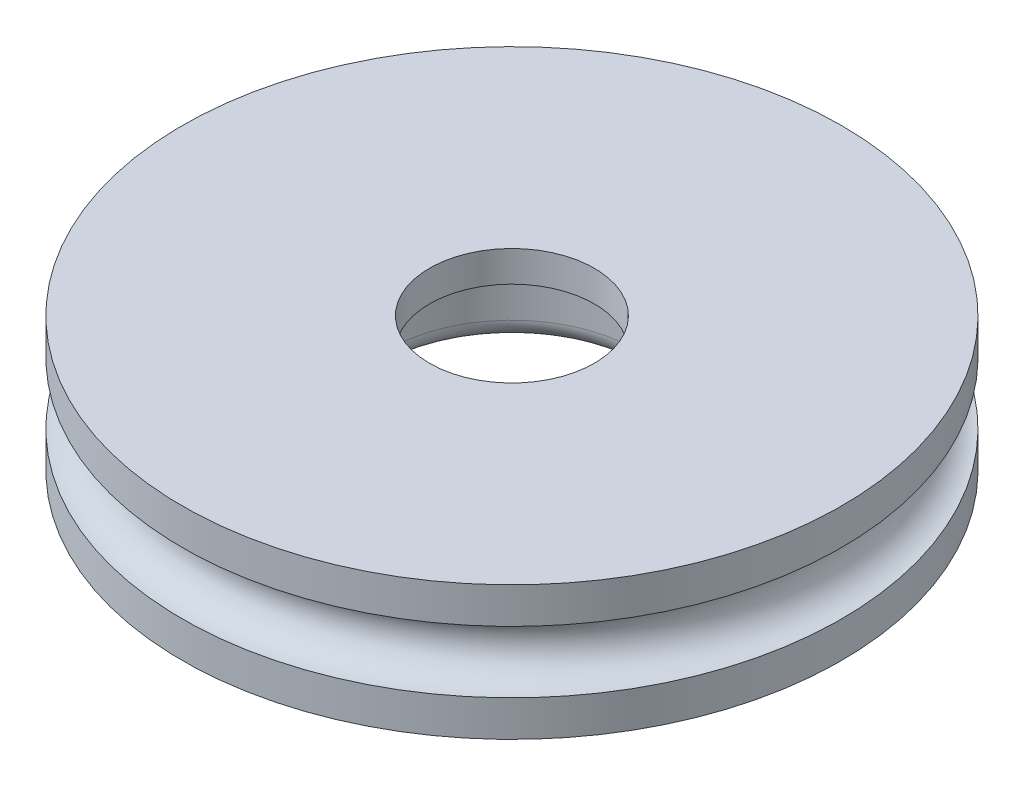
ISO-10303-21;
HEADER;
FILE_DESCRIPTION(('STEP AP214'),'2;1');
FILE_NAME('part.step','',(''),(''),'','','');
FILE_SCHEMA(('AUTOMOTIVE_DESIGN { 1 0 10303 214 1 1 1 1 }'));
ENDSEC;
DATA;
#1=APPLICATION_CONTEXT('core data for automotive mechanical design processes');
#2=APPLICATION_PROTOCOL_DEFINITION('international standard','automotive_design',2000,#1);
#3=PRODUCT_CONTEXT('',#1,'mechanical');
#4=PRODUCT('Part','Part','',(#3));
#5=PRODUCT_RELATED_PRODUCT_CATEGORY('part','',(#4));
#6=PRODUCT_DEFINITION_FORMATION('','',#4);
#7=PRODUCT_DEFINITION_CONTEXT('part definition',#1,'design');
#8=PRODUCT_DEFINITION('design','',#6,#7);
#9=PRODUCT_DEFINITION_SHAPE('','',#8);
#10=(LENGTH_UNIT() NAMED_UNIT(*) SI_UNIT(.MILLI.,.METRE.));
#11=(NAMED_UNIT(*) PLANE_ANGLE_UNIT() SI_UNIT($,.RADIAN.));
#12=(NAMED_UNIT(*) SI_UNIT($,.STERADIAN.) SOLID_ANGLE_UNIT());
#13=UNCERTAINTY_MEASURE_WITH_UNIT(LENGTH_MEASURE(1.E-05),#10,'distance_accuracy_value','');
#14=(GEOMETRIC_REPRESENTATION_CONTEXT(3) GLOBAL_UNCERTAINTY_ASSIGNED_CONTEXT((#13)) GLOBAL_UNIT_ASSIGNED_CONTEXT((#10,
#11,#12)) REPRESENTATION_CONTEXT('',''));
#15=CARTESIAN_POINT('',(0.,0.,0.));
#16=DIRECTION('',(0.,0.,1.));
#17=DIRECTION('',(1.,0.,0.));
#18=AXIS2_PLACEMENT_3D('',#15,#16,#17);
#19=CARTESIAN_POINT('',(0.,1.625,0.));
#20=DIRECTION('',(0.,-1.,0.));
#21=DIRECTION('',(0.,0.,-1.));
#22=AXIS2_PLACEMENT_3D('',#19,#20,#21);
#23=CYLINDRICAL_SURFACE('',#22,3.05);
#24=CARTESIAN_POINT('',(0.,-0.625,0.));
#25=DIRECTION('',(0.,-1.,0.));
#26=DIRECTION('',(0.,0.,-1.));
#27=AXIS2_PLACEMENT_3D('',#24,#25,#26);
#28=CIRCLE('',#27,3.05);
#29=CARTESIAN_POINT('',(0.,-0.625,-3.05));
#30=VERTEX_POINT('',#29);
#31=EDGE_CURVE('E42',#30,#30,#28,.T.);
#32=CARTESIAN_POINT('',(0.,0.375,0.));
#33=DIRECTION('',(0.,1.,0.));
#34=DIRECTION('',(0.,0.,1.));
#35=AXIS2_PLACEMENT_3D('',#32,#33,#34);
#36=CIRCLE('',#35,3.05);
#37=CARTESIAN_POINT('',(0.,0.374999999999999,-3.05));
#38=VERTEX_POINT('',#37);
#39=EDGE_CURVE('E46',#38,#38,#36,.T.);
#40=CARTESIAN_POINT('',(0.,-0.625,-3.05));
#41=CARTESIAN_POINT('',(0.,-0.614583333333333,-3.05));
#42=CARTESIAN_POINT('',(0.,-0.604166666666667,-3.05));
#43=CARTESIAN_POINT('',(0.,-0.583333333333333,-3.05));
#44=CARTESIAN_POINT('',(0.,-0.572916666666667,-3.05));
#45=CARTESIAN_POINT('',(0.,-0.552083333333333,-3.05));
#46=CARTESIAN_POINT('',(0.,-0.541666666666667,-3.05));
#47=CARTESIAN_POINT('',(0.,-0.520833333333333,-3.05));
#48=CARTESIAN_POINT('',(0.,-0.510416666666667,-3.05));
#49=CARTESIAN_POINT('',(0.,-0.489583333333333,-3.05));
#50=CARTESIAN_POINT('',(0.,-0.479166666666666,-3.05));
#51=CARTESIAN_POINT('',(0.,-0.458333333333333,-3.05));
#52=CARTESIAN_POINT('',(0.,-0.447916666666667,-3.05));
#53=CARTESIAN_POINT('',(0.,-0.427083333333334,-3.05));
#54=CARTESIAN_POINT('',(0.,-0.416666666666667,-3.05));
#55=CARTESIAN_POINT('',(0.,-0.395833333333333,-3.05));
#56=CARTESIAN_POINT('',(0.,-0.385416666666667,-3.05));
#57=CARTESIAN_POINT('',(0.,-0.364583333333333,-3.05));
#58=CARTESIAN_POINT('',(0.,-0.354166666666667,-3.05));
#59=CARTESIAN_POINT('',(0.,-0.333333333333333,-3.05));
#60=CARTESIAN_POINT('',(0.,-0.322916666666667,-3.05));
#61=CARTESIAN_POINT('',(0.,-0.302083333333334,-3.05));
#62=CARTESIAN_POINT('',(0.,-0.291666666666667,-3.05));
#63=CARTESIAN_POINT('',(0.,-0.270833333333334,-3.05));
#64=CARTESIAN_POINT('',(0.,-0.260416666666667,-3.05));
#65=CARTESIAN_POINT('',(0.,-0.239583333333334,-3.05));
#66=CARTESIAN_POINT('',(0.,-0.229166666666667,-3.05));
#67=CARTESIAN_POINT('',(0.,-0.208333333333334,-3.05));
#68=CARTESIAN_POINT('',(0.,-0.197916666666667,-3.05));
#69=CARTESIAN_POINT('',(0.,-0.177083333333334,-3.05));
#70=CARTESIAN_POINT('',(0.,-0.166666666666667,-3.05));
#71=CARTESIAN_POINT('',(0.,-0.145833333333334,-3.05));
#72=CARTESIAN_POINT('',(0.,-0.135416666666667,-3.05));
#73=CARTESIAN_POINT('',(0.,-0.114583333333334,-3.05));
#74=CARTESIAN_POINT('',(0.,-0.104166666666667,-3.05));
#75=CARTESIAN_POINT('',(0.,-0.0833333333333337,-3.05));
#76=CARTESIAN_POINT('',(0.,-0.0729166666666671,-3.05));
#77=CARTESIAN_POINT('',(0.,-0.0520833333333338,-3.05));
#78=CARTESIAN_POINT('',(0.,-0.0416666666666671,-3.05));
#79=CARTESIAN_POINT('',(0.,-0.0208333333333338,-3.05));
#80=CARTESIAN_POINT('',(0.,-0.0104166666666671,-3.05));
#81=CARTESIAN_POINT('',(0.,0.0104166666666662,-3.05));
#82=CARTESIAN_POINT('',(0.,0.0208333333333329,-3.05));
#83=CARTESIAN_POINT('',(0.,0.0416666666666663,-3.05));
#84=CARTESIAN_POINT('',(0.,0.0520833333333329,-3.05));
#85=CARTESIAN_POINT('',(0.,0.0729166666666663,-3.05));
#86=CARTESIAN_POINT('',(0.,0.083333333333333,-3.05));
#87=CARTESIAN_POINT('',(0.,0.104166666666666,-3.05));
#88=CARTESIAN_POINT('',(0.,0.114583333333333,-3.05));
#89=CARTESIAN_POINT('',(0.,0.135416666666666,-3.05));
#90=CARTESIAN_POINT('',(0.,0.145833333333333,-3.05));
#91=CARTESIAN_POINT('',(0.,0.166666666666666,-3.05));
#92=CARTESIAN_POINT('',(0.,0.177083333333333,-3.05));
#93=CARTESIAN_POINT('',(0.,0.197916666666666,-3.05));
#94=CARTESIAN_POINT('',(0.,0.208333333333333,-3.05));
#95=CARTESIAN_POINT('',(0.,0.229166666666666,-3.05));
#96=CARTESIAN_POINT('',(0.,0.239583333333333,-3.05));
#97=CARTESIAN_POINT('',(0.,0.260416666666666,-3.05));
#98=CARTESIAN_POINT('',(0.,0.270833333333333,-3.05));
#99=CARTESIAN_POINT('',(0.,0.291666666666666,-3.05));
#100=CARTESIAN_POINT('',(0.,0.302083333333333,-3.05));
#101=CARTESIAN_POINT('',(0.,0.322916666666666,-3.05));
#102=CARTESIAN_POINT('',(0.,0.333333333333333,-3.05));
#103=CARTESIAN_POINT('',(0.,0.354166666666666,-3.05));
#104=CARTESIAN_POINT('',(0.,0.364583333333333,-3.05));
#105=CARTESIAN_POINT('',(0.,0.374999999999999,-3.05));
#106=B_SPLINE_CURVE_WITH_KNOTS('',3,(#40,#41,#42,#43,#44,#45,#46,#47,#48,#49,#50,#51,#52,#53,
#54,#55,#56,#57,#58,#59,#60,#61,#62,#63,#64,#65,#66,#67,#68,#69,#70,#71,#72,#73,#74,#75,#76,#77,
#78,#79,#80,#81,#82,#83,#84,#85,#86,#87,#88,#89,#90,#91,#92,#93,#94,#95,#96,#97,#98,#99,#100,
#101,#102,#103,#104,#105),.UNSPECIFIED.,.F.,.F.,(4,2,2,2,2,2,2,2,2,2,2,2,2,2,2,2,2,2,2,2,2,2,2,
2,2,2,2,2,2,2,2,2,4),(0.,0.03125,0.0625000000000001,0.0937500000000001,0.125,0.15625,0.1875,
0.21875,0.25,0.28125,0.3125,0.34375,0.375,0.40625,0.4375,0.46875,0.5,0.53125,0.562499999999999,
0.593749999999999,0.624999999999999,0.656249999999999,0.6875,0.71875,0.75,0.78125,
0.812499999999999,0.843749999999999,0.874999999999999,0.906249999999999,0.937499999999999,
0.968749999999999,0.999999999999999),.UNSPECIFIED.);
#107=EDGE_CURVE('BSEAM31',#30,#38,#106,.T.);
#108=ORIENTED_EDGE('',*,*,#31,.T.);
#109=ORIENTED_EDGE('',*,*,#39,.T.);
#110=ORIENTED_EDGE('',*,*,#107,.T.);
#111=ORIENTED_EDGE('',*,*,#107,.F.);
#112=EDGE_LOOP('',(#108,#110,#109,#111));
#113=FACE_BOUND('',#112,.T.);
#114=ADVANCED_FACE('F31',(#113),#23,.F.);
#115=CARTESIAN_POINT('',(0.,1.625,0.));
#116=DIRECTION('',(0.,-1.,0.));
#117=DIRECTION('',(0.,0.,-1.));
#118=AXIS2_PLACEMENT_3D('',#115,#116,#117);
#119=CYLINDRICAL_SURFACE('',#118,8.);
#120=CARTESIAN_POINT('',(0.,0.75,0.));
#121=DIRECTION('',(0.,1.,0.));
#122=DIRECTION('',(0.,0.,1.));
#123=AXIS2_PLACEMENT_3D('',#120,#121,#122);
#124=CIRCLE('',#123,8.);
#125=CARTESIAN_POINT('',(0.,0.75,-8.));
#126=VERTEX_POINT('',#125);
#127=EDGE_CURVE('E60',#126,#126,#124,.T.);
#128=CARTESIAN_POINT('',(0.,1.625,0.));
#129=DIRECTION('',(0.,1.,0.));
#130=DIRECTION('',(0.,0.,1.));
#131=AXIS2_PLACEMENT_3D('',#128,#129,#130);
#132=CIRCLE('',#131,8.);
#133=CARTESIAN_POINT('',(0.,1.625,-8.));
#134=VERTEX_POINT('',#133);
#135=EDGE_CURVE('E51',#134,#134,#132,.T.);
#136=CARTESIAN_POINT('',(0.,0.75,-8.));
#137=CARTESIAN_POINT('',(0.,0.759114583333333,-8.));
#138=CARTESIAN_POINT('',(0.,0.768229166666667,-8.));
#139=CARTESIAN_POINT('',(0.,0.786458333333333,-8.));
#140=CARTESIAN_POINT('',(0.,0.795572916666667,-8.));
#141=CARTESIAN_POINT('',(0.,0.813802083333333,-8.));
#142=CARTESIAN_POINT('',(0.,0.822916666666667,-8.));
#143=CARTESIAN_POINT('',(0.,0.841145833333333,-8.));
#144=CARTESIAN_POINT('',(0.,0.850260416666667,-8.));
#145=CARTESIAN_POINT('',(0.,0.868489583333333,-8.));
#146=CARTESIAN_POINT('',(0.,0.877604166666667,-8.));
#147=CARTESIAN_POINT('',(0.,0.895833333333333,-8.));
#148=CARTESIAN_POINT('',(0.,0.904947916666667,-8.));
#149=CARTESIAN_POINT('',(0.,0.923177083333333,-8.));
#150=CARTESIAN_POINT('',(0.,0.932291666666667,-8.));
#151=CARTESIAN_POINT('',(0.,0.950520833333333,-8.));
#152=CARTESIAN_POINT('',(0.,0.959635416666667,-8.));
#153=CARTESIAN_POINT('',(0.,0.977864583333333,-8.));
#154=CARTESIAN_POINT('',(0.,0.986979166666667,-8.));
#155=CARTESIAN_POINT('',(0.,1.00520833333333,-8.));
#156=CARTESIAN_POINT('',(0.,1.01432291666667,-8.));
#157=CARTESIAN_POINT('',(0.,1.03255208333333,-8.));
#158=CARTESIAN_POINT('',(0.,1.04166666666667,-8.));
#159=CARTESIAN_POINT('',(0.,1.05989583333333,-8.));
#160=CARTESIAN_POINT('',(0.,1.06901041666667,-8.));
#161=CARTESIAN_POINT('',(0.,1.08723958333333,-8.));
#162=CARTESIAN_POINT('',(0.,1.09635416666667,-8.));
#163=CARTESIAN_POINT('',(0.,1.11458333333333,-8.));
#164=CARTESIAN_POINT('',(0.,1.12369791666667,-8.));
#165=CARTESIAN_POINT('',(0.,1.14192708333333,-8.));
#166=CARTESIAN_POINT('',(0.,1.15104166666667,-8.));
#167=CARTESIAN_POINT('',(0.,1.16927083333333,-8.));
#168=CARTESIAN_POINT('',(0.,1.17838541666667,-8.));
#169=CARTESIAN_POINT('',(0.,1.19661458333333,-8.));
#170=CARTESIAN_POINT('',(0.,1.20572916666667,-8.));
#171=CARTESIAN_POINT('',(0.,1.22395833333333,-8.));
#172=CARTESIAN_POINT('',(0.,1.23307291666667,-8.));
#173=CARTESIAN_POINT('',(0.,1.25130208333333,-8.));
#174=CARTESIAN_POINT('',(0.,1.26041666666667,-8.));
#175=CARTESIAN_POINT('',(0.,1.27864583333333,-8.));
#176=CARTESIAN_POINT('',(0.,1.28776041666667,-8.));
#177=CARTESIAN_POINT('',(0.,1.30598958333333,-8.));
#178=CARTESIAN_POINT('',(0.,1.31510416666667,-8.));
#179=CARTESIAN_POINT('',(0.,1.33333333333333,-8.));
#180=CARTESIAN_POINT('',(0.,1.34244791666667,-8.));
#181=CARTESIAN_POINT('',(0.,1.36067708333333,-8.));
#182=CARTESIAN_POINT('',(0.,1.36979166666667,-8.));
#183=CARTESIAN_POINT('',(0.,1.38802083333333,-8.));
#184=CARTESIAN_POINT('',(0.,1.39713541666667,-8.));
#185=CARTESIAN_POINT('',(0.,1.41536458333333,-8.));
#186=CARTESIAN_POINT('',(0.,1.42447916666667,-8.));
#187=CARTESIAN_POINT('',(0.,1.44270833333333,-8.));
#188=CARTESIAN_POINT('',(0.,1.45182291666667,-8.));
#189=CARTESIAN_POINT('',(0.,1.47005208333333,-8.));
#190=CARTESIAN_POINT('',(0.,1.47916666666667,-8.));
#191=CARTESIAN_POINT('',(0.,1.49739583333333,-8.));
#192=CARTESIAN_POINT('',(0.,1.50651041666667,-8.));
#193=CARTESIAN_POINT('',(0.,1.52473958333333,-8.));
#194=CARTESIAN_POINT('',(0.,1.53385416666667,-8.));
#195=CARTESIAN_POINT('',(0.,1.55208333333333,-8.));
#196=CARTESIAN_POINT('',(0.,1.56119791666667,-8.));
#197=CARTESIAN_POINT('',(0.,1.57942708333333,-8.));
#198=CARTESIAN_POINT('',(0.,1.58854166666667,-8.));
#199=CARTESIAN_POINT('',(0.,1.60677083333333,-8.));
#200=CARTESIAN_POINT('',(0.,1.61588541666667,-8.));
#201=CARTESIAN_POINT('',(0.,1.625,-8.));
#202=B_SPLINE_CURVE_WITH_KNOTS('',3,(#136,#137,#138,#139,#140,#141,#142,#143,#144,#145,#146,
#147,#148,#149,#150,#151,#152,#153,#154,#155,#156,#157,#158,#159,#160,#161,#162,#163,#164,#165,
#166,#167,#168,#169,#170,#171,#172,#173,#174,#175,#176,#177,#178,#179,#180,#181,#182,#183,#184,
#185,#186,#187,#188,#189,#190,#191,#192,#193,#194,#195,#196,#197,#198,#199,#200,#201),
.UNSPECIFIED.,.F.,.F.,(4,2,2,2,2,2,2,2,2,2,2,2,2,2,2,2,2,2,2,2,2,2,2,2,2,2,2,2,2,2,2,2,4),(0.,
0.02734375,0.0546874999999999,0.08203125,0.109375,0.13671875,0.1640625,0.19140625,0.21875,
0.24609375,0.2734375,0.30078125,0.328125,0.35546875,0.3828125,0.41015625,0.4375,0.46484375,
0.4921875,0.51953125,0.546875,0.57421875,0.6015625,0.62890625,0.65625,0.68359375,0.7109375,
0.73828125,0.765625,0.79296875,0.8203125,0.84765625,0.875),.UNSPECIFIED.);
#203=EDGE_CURVE('BSEAM97',#126,#134,#202,.T.);
#204=ORIENTED_EDGE('',*,*,#127,.T.);
#205=ORIENTED_EDGE('',*,*,#135,.F.);
#206=ORIENTED_EDGE('',*,*,#203,.T.);
#207=ORIENTED_EDGE('',*,*,#203,.F.);
#208=EDGE_LOOP('',(#204,#206,#205,#207));
#209=FACE_BOUND('',#208,.T.);
#210=ADVANCED_FACE('F97',(#209),#119,.T.);
#211=CARTESIAN_POINT('',(0.,1.625,0.));
#212=DIRECTION('',(0.,1.,0.));
#213=DIRECTION('',(0.,0.,1.));
#214=AXIS2_PLACEMENT_3D('',#211,#212,#213);
#215=PLANE('',#214);
#216=ORIENTED_EDGE('',*,*,#135,.T.);
#217=EDGE_LOOP('',(#216));
#218=FACE_BOUND('',#217,.T.);
#219=CARTESIAN_POINT('',(0.,1.625,0.));
#220=DIRECTION('',(0.,1.,0.));
#221=DIRECTION('',(0.,0.,1.));
#222=AXIS2_PLACEMENT_3D('',#219,#220,#221);
#223=CIRCLE('',#222,2.);
#224=CARTESIAN_POINT('',(0.,1.625,2.));
#225=VERTEX_POINT('',#224);
#226=EDGE_CURVE('E64',#225,#225,#223,.T.);
#227=ORIENTED_EDGE('',*,*,#226,.F.);
#228=EDGE_LOOP('',(#227));
#229=FACE_BOUND('',#228,.T.);
#230=ADVANCED_FACE('F89',(#218,#229),#215,.T.);
#231=CARTESIAN_POINT('',(0.,-1.625,0.));
#232=DIRECTION('',(0.,1.,0.));
#233=DIRECTION('',(0.,0.,1.));
#234=AXIS2_PLACEMENT_3D('',#231,#232,#233);
#235=PLANE('',#234);
#236=CARTESIAN_POINT('',(0.,-1.625,0.));
#237=DIRECTION('',(0.,-1.,0.));
#238=DIRECTION('',(0.,0.,-1.));
#239=AXIS2_PLACEMENT_3D('',#236,#237,#238);
#240=CIRCLE('',#239,6.5);
#241=CARTESIAN_POINT('',(0.,-1.625,-6.5));
#242=VERTEX_POINT('',#241);
#243=EDGE_CURVE('E70',#242,#242,#240,.T.);
#244=ORIENTED_EDGE('',*,*,#243,.F.);
#245=EDGE_LOOP('',(#244));
#246=FACE_BOUND('',#245,.T.);
#247=CARTESIAN_POINT('',(0.,-1.625,0.));
#248=DIRECTION('',(0.,1.,0.));
#249=DIRECTION('',(0.,0.,1.));
#250=AXIS2_PLACEMENT_3D('',#247,#248,#249);
#251=CIRCLE('',#250,8.);
#252=CARTESIAN_POINT('',(0.,-1.625,-8.));
#253=VERTEX_POINT('',#252);
#254=EDGE_CURVE('E52',#253,#253,#251,.T.);
#255=ORIENTED_EDGE('',*,*,#254,.F.);
#256=EDGE_LOOP('',(#255));
#257=FACE_BOUND('',#256,.T.);
#258=ADVANCED_FACE('F85',(#246,#257),#235,.F.);
#259=CARTESIAN_POINT('',(0.,-0.75,0.));
#260=DIRECTION('',(0.,1.,0.));
#261=DIRECTION('',(0.,0.,1.));
#262=AXIS2_PLACEMENT_3D('',#259,#260,#261);
#263=CIRCLE('',#262,8.);
#264=CARTESIAN_POINT('',(0.,-0.75,-8.));
#265=VERTEX_POINT('',#264);
#266=EDGE_CURVE('E55',#265,#265,#263,.T.);
#267=CARTESIAN_POINT('',(0.,-0.75,-8.));
#268=CARTESIAN_POINT('',(0.,-0.759114583333333,-8.));
#269=CARTESIAN_POINT('',(0.,-0.768229166666667,-8.));
#270=CARTESIAN_POINT('',(0.,-0.786458333333333,-8.));
#271=CARTESIAN_POINT('',(0.,-0.795572916666667,-8.));
#272=CARTESIAN_POINT('',(0.,-0.813802083333333,-8.));
#273=CARTESIAN_POINT('',(0.,-0.822916666666667,-8.));
#274=CARTESIAN_POINT('',(0.,-0.841145833333333,-8.));
#275=CARTESIAN_POINT('',(0.,-0.850260416666667,-8.));
#276=CARTESIAN_POINT('',(0.,-0.868489583333333,-8.));
#277=CARTESIAN_POINT('',(0.,-0.877604166666667,-8.));
#278=CARTESIAN_POINT('',(0.,-0.895833333333333,-8.));
#279=CARTESIAN_POINT('',(0.,-0.904947916666667,-8.));
#280=CARTESIAN_POINT('',(0.,-0.923177083333333,-8.));
#281=CARTESIAN_POINT('',(0.,-0.932291666666667,-8.));
#282=CARTESIAN_POINT('',(0.,-0.950520833333333,-8.));
#283=CARTESIAN_POINT('',(0.,-0.959635416666667,-8.));
#284=CARTESIAN_POINT('',(0.,-0.977864583333333,-8.));
#285=CARTESIAN_POINT('',(0.,-0.986979166666667,-8.));
#286=CARTESIAN_POINT('',(0.,-1.00520833333333,-8.));
#287=CARTESIAN_POINT('',(0.,-1.01432291666667,-8.));
#288=CARTESIAN_POINT('',(0.,-1.03255208333333,-8.));
#289=CARTESIAN_POINT('',(0.,-1.04166666666667,-8.));
#290=CARTESIAN_POINT('',(0.,-1.05989583333333,-8.));
#291=CARTESIAN_POINT('',(0.,-1.06901041666667,-8.));
#292=CARTESIAN_POINT('',(0.,-1.08723958333333,-8.));
#293=CARTESIAN_POINT('',(0.,-1.09635416666667,-8.));
#294=CARTESIAN_POINT('',(0.,-1.11458333333333,-8.));
#295=CARTESIAN_POINT('',(0.,-1.12369791666667,-8.));
#296=CARTESIAN_POINT('',(0.,-1.14192708333333,-8.));
#297=CARTESIAN_POINT('',(0.,-1.15104166666667,-8.));
#298=CARTESIAN_POINT('',(0.,-1.16927083333333,-8.));
#299=CARTESIAN_POINT('',(0.,-1.17838541666667,-8.));
#300=CARTESIAN_POINT('',(0.,-1.19661458333333,-8.));
#301=CARTESIAN_POINT('',(0.,-1.20572916666667,-8.));
#302=CARTESIAN_POINT('',(0.,-1.22395833333333,-8.));
#303=CARTESIAN_POINT('',(0.,-1.23307291666667,-8.));
#304=CARTESIAN_POINT('',(0.,-1.25130208333333,-8.));
#305=CARTESIAN_POINT('',(0.,-1.26041666666667,-8.));
#306=CARTESIAN_POINT('',(0.,-1.27864583333333,-8.));
#307=CARTESIAN_POINT('',(0.,-1.28776041666667,-8.));
#308=CARTESIAN_POINT('',(0.,-1.30598958333333,-8.));
#309=CARTESIAN_POINT('',(0.,-1.31510416666667,-8.));
#310=CARTESIAN_POINT('',(0.,-1.33333333333333,-8.));
#311=CARTESIAN_POINT('',(0.,-1.34244791666667,-8.));
#312=CARTESIAN_POINT('',(0.,-1.36067708333333,-8.));
#313=CARTESIAN_POINT('',(0.,-1.36979166666667,-8.));
#314=CARTESIAN_POINT('',(0.,-1.38802083333333,-8.));
#315=CARTESIAN_POINT('',(0.,-1.39713541666667,-8.));
#316=CARTESIAN_POINT('',(0.,-1.41536458333333,-8.));
#317=CARTESIAN_POINT('',(0.,-1.42447916666667,-8.));
#318=CARTESIAN_POINT('',(0.,-1.44270833333333,-8.));
#319=CARTESIAN_POINT('',(0.,-1.45182291666667,-8.));
#320=CARTESIAN_POINT('',(0.,-1.47005208333333,-8.));
#321=CARTESIAN_POINT('',(0.,-1.47916666666667,-8.));
#322=CARTESIAN_POINT('',(0.,-1.49739583333333,-8.));
#323=CARTESIAN_POINT('',(0.,-1.50651041666667,-8.));
#324=CARTESIAN_POINT('',(0.,-1.52473958333333,-8.));
#325=CARTESIAN_POINT('',(0.,-1.53385416666667,-8.));
#326=CARTESIAN_POINT('',(0.,-1.55208333333333,-8.));
#327=CARTESIAN_POINT('',(0.,-1.56119791666667,-8.));
#328=CARTESIAN_POINT('',(0.,-1.57942708333333,-8.));
#329=CARTESIAN_POINT('',(0.,-1.58854166666667,-8.));
#330=CARTESIAN_POINT('',(0.,-1.60677083333333,-8.));
#331=CARTESIAN_POINT('',(0.,-1.61588541666667,-8.));
#332=CARTESIAN_POINT('',(0.,-1.625,-8.));
#333=B_SPLINE_CURVE_WITH_KNOTS('',3,(#267,#268,#269,#270,#271,#272,#273,#274,#275,#276,#277,
#278,#279,#280,#281,#282,#283,#284,#285,#286,#287,#288,#289,#290,#291,#292,#293,#294,#295,#296,
#297,#298,#299,#300,#301,#302,#303,#304,#305,#306,#307,#308,#309,#310,#311,#312,#313,#314,#315,
#316,#317,#318,#319,#320,#321,#322,#323,#324,#325,#326,#327,#328,#329,#330,#331,#332),
.UNSPECIFIED.,.F.,.F.,(4,2,2,2,2,2,2,2,2,2,2,2,2,2,2,2,2,2,2,2,2,2,2,2,2,2,2,2,2,2,2,2,4),(0.,
0.02734375,0.0546875,0.0820312500000001,0.109375,0.13671875,0.1640625,0.19140625,0.21875,
0.24609375,0.2734375,0.30078125,0.328125,0.35546875,0.3828125,0.41015625,0.4375,0.46484375,
0.4921875,0.51953125,0.546875,0.57421875,0.6015625,0.62890625,0.65625,0.68359375,0.7109375,
0.73828125,0.765625,0.79296875,0.8203125,0.84765625,0.875),.UNSPECIFIED.);
#334=EDGE_CURVE('BSEAM88',#265,#253,#333,.T.);
#335=ORIENTED_EDGE('',*,*,#266,.F.);
#336=ORIENTED_EDGE('',*,*,#254,.T.);
#337=ORIENTED_EDGE('',*,*,#334,.T.);
#338=ORIENTED_EDGE('',*,*,#334,.F.);
#339=EDGE_LOOP('',(#335,#337,#336,#338));
#340=FACE_BOUND('',#339,.T.);
#341=ADVANCED_FACE('F88',(#340),#119,.T.);
#342=CARTESIAN_POINT('',(0.,0.,0.));
#343=DIRECTION('',(0.,1.,0.));
#344=DIRECTION('',(0.,0.,1.));
#345=AXIS2_PLACEMENT_3D('',#342,#343,#344);
#346=TOROIDAL_SURFACE('',#345,8.,0.75);
#347=ORIENTED_EDGE('',*,*,#127,.F.);
#348=EDGE_LOOP('',(#347));
#349=FACE_BOUND('',#348,.T.);
#350=ORIENTED_EDGE('',*,*,#266,.T.);
#351=EDGE_LOOP('',(#350));
#352=FACE_BOUND('',#351,.T.);
#353=ADVANCED_FACE('F94',(#349,#352),#346,.F.);
#354=CARTESIAN_POINT('',(0.,0.875,0.));
#355=DIRECTION('',(0.,1.,0.));
#356=DIRECTION('',(0.,0.,1.));
#357=AXIS2_PLACEMENT_3D('',#354,#355,#356);
#358=PLANE('',#357);
#359=CARTESIAN_POINT('',(0.,0.875,0.));
#360=DIRECTION('',(0.,1.,0.));
#361=DIRECTION('',(0.,0.,1.));
#362=AXIS2_PLACEMENT_3D('',#359,#360,#361);
#363=CIRCLE('',#362,2.55);
#364=CARTESIAN_POINT('',(0.,0.875,2.55));
#365=VERTEX_POINT('',#364);
#366=EDGE_CURVE('E10',#365,#365,#363,.F.);
#367=ORIENTED_EDGE('',*,*,#366,.T.);
#368=EDGE_LOOP('',(#367));
#369=FACE_BOUND('',#368,.T.);
#370=CARTESIAN_POINT('',(0.,0.875,0.));
#371=DIRECTION('',(0.,1.,0.));
#372=DIRECTION('',(0.,0.,1.));
#373=AXIS2_PLACEMENT_3D('',#370,#371,#372);
#374=CIRCLE('',#373,2.);
#375=CARTESIAN_POINT('',(0.,0.875,2.));
#376=VERTEX_POINT('',#375);
#377=EDGE_CURVE('E63',#376,#376,#374,.T.);
#378=ORIENTED_EDGE('',*,*,#377,.T.);
#379=EDGE_LOOP('',(#378));
#380=FACE_BOUND('',#379,.T.);
#381=ADVANCED_FACE('F101',(#369,#380),#358,.F.);
#382=CARTESIAN_POINT('',(0.,0.875,0.));
#383=DIRECTION('',(0.,1.,0.));
#384=DIRECTION('',(0.,0.,1.));
#385=AXIS2_PLACEMENT_3D('',#382,#383,#384);
#386=CYLINDRICAL_SURFACE('',#385,2.);
#387=ORIENTED_EDGE('',*,*,#377,.F.);
#388=EDGE_LOOP('',(#387));
#389=FACE_BOUND('',#388,.T.);
#390=ORIENTED_EDGE('',*,*,#226,.T.);
#391=EDGE_LOOP('',(#390));
#392=FACE_BOUND('',#391,.T.);
#393=ADVANCED_FACE('F81',(#389,#392),#386,.F.);
#394=CARTESIAN_POINT('',(0.,-1.125,0.));
#395=DIRECTION('',(0.,-1.,0.));
#396=DIRECTION('',(0.,0.,-1.));
#397=AXIS2_PLACEMENT_3D('',#394,#395,#396);
#398=CYLINDRICAL_SURFACE('',#397,6.5);
#399=CARTESIAN_POINT('',(0.,-1.125,0.));
#400=DIRECTION('',(0.,-1.,0.));
#401=DIRECTION('',(0.,0.,-1.));
#402=AXIS2_PLACEMENT_3D('',#399,#400,#401);
#403=CIRCLE('',#402,6.5);
#404=CARTESIAN_POINT('',(0.,-1.125,-6.5));
#405=VERTEX_POINT('',#404);
#406=EDGE_CURVE('E67',#405,#405,#403,.T.);
#407=ORIENTED_EDGE('',*,*,#406,.F.);
#408=EDGE_LOOP('',(#407));
#409=FACE_BOUND('',#408,.T.);
#410=ORIENTED_EDGE('',*,*,#243,.T.);
#411=EDGE_LOOP('',(#410));
#412=FACE_BOUND('',#411,.T.);
#413=ADVANCED_FACE('F78',(#409,#412),#398,.F.);
#414=CARTESIAN_POINT('',(0.,-1.125,0.));
#415=DIRECTION('',(0.,-1.,0.));
#416=DIRECTION('',(0.,0.,-1.));
#417=AXIS2_PLACEMENT_3D('',#414,#415,#416);
#418=PLANE('',#417);
#419=CARTESIAN_POINT('',(0.,-1.125,0.));
#420=DIRECTION('',(0.,-1.,0.));
#421=DIRECTION('',(0.,0.,-1.));
#422=AXIS2_PLACEMENT_3D('',#419,#420,#421);
#423=CIRCLE('',#422,3.55);
#424=CARTESIAN_POINT('',(0.,-1.125,-3.55));
#425=VERTEX_POINT('',#424);
#426=EDGE_CURVE('E38',#425,#425,#423,.F.);
#427=ORIENTED_EDGE('',*,*,#426,.T.);
#428=EDGE_LOOP('',(#427));
#429=FACE_BOUND('',#428,.T.);
#430=ORIENTED_EDGE('',*,*,#406,.T.);
#431=EDGE_LOOP('',(#430));
#432=FACE_BOUND('',#431,.T.);
#433=ADVANCED_FACE('F76',(#429,#432),#418,.T.);
#434=CARTESIAN_POINT('',(0.,-0.625,0.));
#435=DIRECTION('',(0.,-1.,0.));
#436=DIRECTION('',(0.,0.,-1.));
#437=AXIS2_PLACEMENT_3D('',#434,#435,#436);
#438=TOROIDAL_SURFACE('',#437,3.55,0.5);
#439=ORIENTED_EDGE('',*,*,#426,.F.);
#440=EDGE_LOOP('',(#439));
#441=FACE_BOUND('',#440,.T.);
#442=ORIENTED_EDGE('',*,*,#31,.F.);
#443=EDGE_LOOP('',(#442));
#444=FACE_BOUND('',#443,.T.);
#445=ADVANCED_FACE('F132',(#441,#444),#438,.T.);
#446=CARTESIAN_POINT('',(0.,0.375,0.));
#447=DIRECTION('',(0.,1.,0.));
#448=DIRECTION('',(0.,0.,1.));
#449=AXIS2_PLACEMENT_3D('',#446,#447,#448);
#450=TOROIDAL_SURFACE('',#449,2.55,0.5);
#451=ORIENTED_EDGE('',*,*,#366,.F.);
#452=EDGE_LOOP('',(#451));
#453=FACE_BOUND('',#452,.T.);
#454=ORIENTED_EDGE('',*,*,#39,.F.);
#455=EDGE_LOOP('',(#454));
#456=FACE_BOUND('',#455,.T.);
#457=ADVANCED_FACE('F33',(#453,#456),#450,.F.);
#458=CLOSED_SHELL('',(#114,#210,#230,#258,#341,#353,#381,#393,#413,#433,#445,#457));
#459=MANIFOLD_SOLID_BREP('B2',#458);
#460=ADVANCED_BREP_SHAPE_REPRESENTATION('',(#18,#459),#14);
#461=SHAPE_DEFINITION_REPRESENTATION(#9,#460);
ENDSEC;
END-ISO-10303-21;
